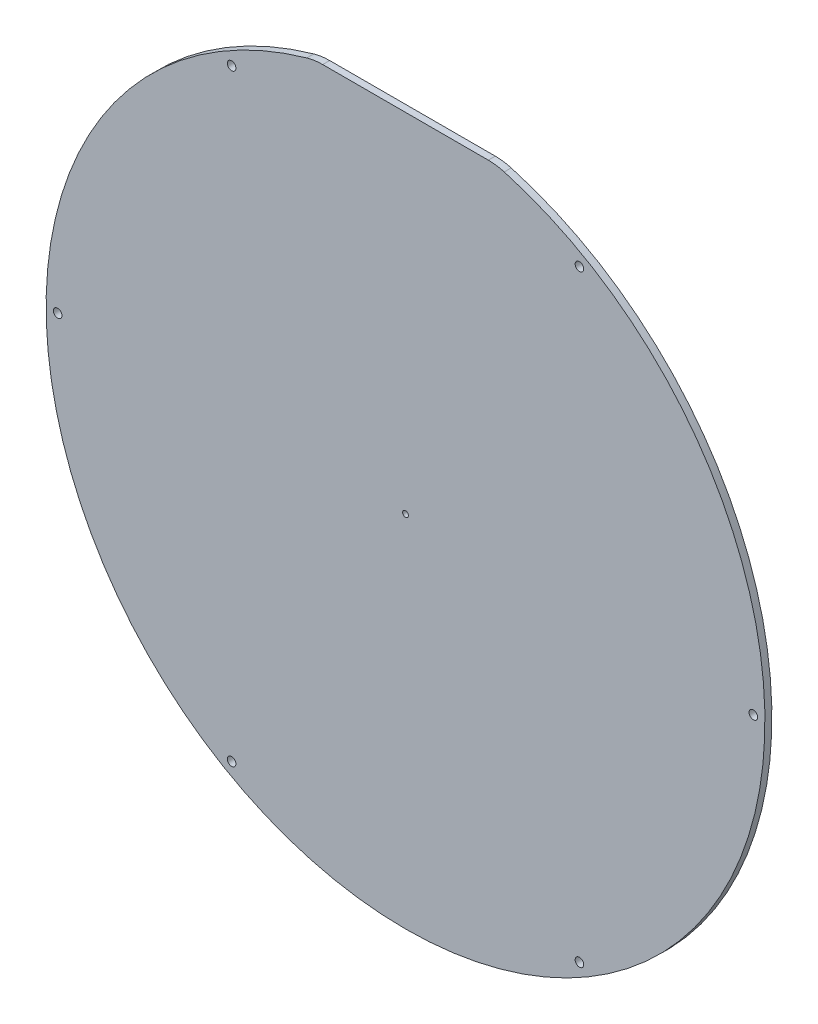
ISO-10303-21;
HEADER;
FILE_DESCRIPTION(('STEP AP214'),'2;1');
FILE_NAME('part.step','',(''),(''),'','','');
FILE_SCHEMA(('AUTOMOTIVE_DESIGN { 1 0 10303 214 1 1 1 1 }'));
ENDSEC;
DATA;
#1=APPLICATION_CONTEXT('core data for automotive mechanical design processes');
#2=APPLICATION_PROTOCOL_DEFINITION('international standard','automotive_design',2000,#1);
#3=PRODUCT_CONTEXT('',#1,'mechanical');
#4=PRODUCT('Part','Part','',(#3));
#5=PRODUCT_RELATED_PRODUCT_CATEGORY('part','',(#4));
#6=PRODUCT_DEFINITION_FORMATION('','',#4);
#7=PRODUCT_DEFINITION_CONTEXT('part definition',#1,'design');
#8=PRODUCT_DEFINITION('design','',#6,#7);
#9=PRODUCT_DEFINITION_SHAPE('','',#8);
#10=(LENGTH_UNIT() NAMED_UNIT(*) SI_UNIT(.MILLI.,.METRE.));
#11=(NAMED_UNIT(*) PLANE_ANGLE_UNIT() SI_UNIT($,.RADIAN.));
#12=(NAMED_UNIT(*) SI_UNIT($,.STERADIAN.) SOLID_ANGLE_UNIT());
#13=UNCERTAINTY_MEASURE_WITH_UNIT(LENGTH_MEASURE(1.E-05),#10,'distance_accuracy_value','');
#14=(GEOMETRIC_REPRESENTATION_CONTEXT(3) GLOBAL_UNCERTAINTY_ASSIGNED_CONTEXT((#13)) GLOBAL_UNIT_ASSIGNED_CONTEXT((#10,
#11,#12)) REPRESENTATION_CONTEXT('',''));
#15=CARTESIAN_POINT('',(0.,0.,0.));
#16=DIRECTION('',(0.,0.,1.));
#17=DIRECTION('',(1.,0.,0.));
#18=AXIS2_PLACEMENT_3D('',#15,#16,#17);
#19=CARTESIAN_POINT('',(0.,0.,3.));
#20=DIRECTION('',(0.,0.,1.));
#21=DIRECTION('',(1.,0.,0.));
#22=AXIS2_PLACEMENT_3D('',#19,#20,#21);
#23=PLANE('',#22);
#24=CARTESIAN_POINT('',(0.,0.,3.));
#25=DIRECTION('',(0.,0.,1.));
#26=DIRECTION('',(1.,0.,0.));
#27=AXIS2_PLACEMENT_3D('',#24,#25,#26);
#28=CIRCLE('',#27,1.25);
#29=CARTESIAN_POINT('',(1.25,0.,3.));
#30=VERTEX_POINT('',#29);
#31=EDGE_CURVE('E108',#30,#30,#28,.T.);
#32=ORIENTED_EDGE('',*,*,#31,.F.);
#33=EDGE_LOOP('',(#32));
#34=FACE_BOUND('',#33,.T.);
#35=CARTESIAN_POINT('',(-150.,0.,3.));
#36=DIRECTION('',(0.,0.,1.));
#37=DIRECTION('',(1.,0.,0.));
#38=AXIS2_PLACEMENT_3D('',#35,#36,#37);
#39=CIRCLE('',#38,1.85);
#40=CARTESIAN_POINT('',(-148.15,0.,3.));
#41=VERTEX_POINT('',#40);
#42=EDGE_CURVE('E147',#41,#41,#39,.T.);
#43=ORIENTED_EDGE('',*,*,#42,.F.);
#44=EDGE_LOOP('',(#43));
#45=FACE_BOUND('',#44,.T.);
#46=CARTESIAN_POINT('',(-74.9999999999997,-129.903810567666,3.));
#47=DIRECTION('',(0.,0.,1.));
#48=DIRECTION('',(0.499999999999998,0.86602540378444,0.));
#49=AXIS2_PLACEMENT_3D('',#46,#47,#48);
#50=CIRCLE('',#49,1.85);
#51=CARTESIAN_POINT('',(-74.0749999999997,-128.301663570665,3.));
#52=VERTEX_POINT('',#51);
#53=EDGE_CURVE('E154',#52,#52,#50,.T.);
#54=ORIENTED_EDGE('',*,*,#53,.F.);
#55=EDGE_LOOP('',(#54));
#56=FACE_BOUND('',#55,.T.);
#57=CARTESIAN_POINT('',(75.0000000000006,-129.903810567665,3.));
#58=DIRECTION('',(0.,0.,1.));
#59=DIRECTION('',(-0.500000000000004,0.866025403784436,0.));
#60=AXIS2_PLACEMENT_3D('',#57,#58,#59);
#61=CIRCLE('',#60,1.85);
#62=CARTESIAN_POINT('',(74.0750000000006,-128.301663570664,3.));
#63=VERTEX_POINT('',#62);
#64=EDGE_CURVE('E160',#63,#63,#61,.T.);
#65=ORIENTED_EDGE('',*,*,#64,.F.);
#66=EDGE_LOOP('',(#65));
#67=FACE_BOUND('',#66,.T.);
#68=CARTESIAN_POINT('',(150.,0.,3.));
#69=DIRECTION('',(0.,0.,1.));
#70=DIRECTION('',(-1.,0.,0.));
#71=AXIS2_PLACEMENT_3D('',#68,#69,#70);
#72=CIRCLE('',#71,1.85);
#73=CARTESIAN_POINT('',(148.15,0.,3.));
#74=VERTEX_POINT('',#73);
#75=EDGE_CURVE('E166',#74,#74,#72,.T.);
#76=ORIENTED_EDGE('',*,*,#75,.F.);
#77=EDGE_LOOP('',(#76));
#78=FACE_BOUND('',#77,.T.);
#79=CARTESIAN_POINT('',(74.9999999999988,129.903810567666,3.));
#80=DIRECTION('',(0.,0.,1.));
#81=DIRECTION('',(-0.499999999999992,-0.866025403784443,0.));
#82=AXIS2_PLACEMENT_3D('',#79,#80,#81);
#83=CIRCLE('',#82,1.85);
#84=CARTESIAN_POINT('',(74.0749999999988,128.301663570665,3.));
#85=VERTEX_POINT('',#84);
#86=EDGE_CURVE('E172',#85,#85,#83,.T.);
#87=ORIENTED_EDGE('',*,*,#86,.F.);
#88=EDGE_LOOP('',(#87));
#89=FACE_BOUND('',#88,.T.);
#90=CARTESIAN_POINT('',(-75.0000000000015,129.903810567665,3.));
#91=DIRECTION('',(0.,0.,1.));
#92=DIRECTION('',(0.50000000000001,-0.866025403784433,0.));
#93=AXIS2_PLACEMENT_3D('',#90,#91,#92);
#94=CIRCLE('',#93,1.85);
#95=CARTESIAN_POINT('',(-74.0750000000015,128.301663570664,3.));
#96=VERTEX_POINT('',#95);
#97=EDGE_CURVE('E86',#96,#96,#94,.T.);
#98=ORIENTED_EDGE('',*,*,#97,.F.);
#99=EDGE_LOOP('',(#98));
#100=FACE_BOUND('',#99,.T.);
#101=CARTESIAN_POINT('',(0.,0.,3.));
#102=DIRECTION('',(0.,0.,1.));
#103=DIRECTION('',(1.,0.,0.));
#104=AXIS2_PLACEMENT_3D('',#101,#102,#103);
#105=CIRCLE('',#104,155.);
#106=CARTESIAN_POINT('',(-42.5739002470825,149.038461538462,3.));
#107=VERTEX_POINT('',#106);
#108=CARTESIAN_POINT('',(42.5739002470825,149.038461538462,3.));
#109=VERTEX_POINT('',#108);
#110=EDGE_CURVE('E74',#107,#109,#105,.T.);
#111=ORIENTED_EDGE('',*,*,#110,.T.);
#112=CARTESIAN_POINT('',(35.7071421427144,125.,3.));
#113=DIRECTION('',(0.,0.,1.));
#114=DIRECTION('',(1.,0.,0.));
#115=AXIS2_PLACEMENT_3D('',#112,#113,#114);
#116=CIRCLE('',#115,25.);
#117=CARTESIAN_POINT('',(35.7071421427144,150.,3.));
#118=VERTEX_POINT('',#117);
#119=EDGE_CURVE('E11',#109,#118,#116,.T.);
#120=ORIENTED_EDGE('',*,*,#119,.T.);
#121=DIRECTION('',(-1.,0.,0.));
#122=VECTOR('',#121,1.);
#123=CARTESIAN_POINT('',(0.,150.,3.));
#124=LINE('',#123,#122);
#125=CARTESIAN_POINT('',(-35.7071421427144,150.,3.));
#126=VERTEX_POINT('',#125);
#127=EDGE_CURVE('E73',#118,#126,#124,.T.);
#128=ORIENTED_EDGE('',*,*,#127,.T.);
#129=CARTESIAN_POINT('',(-35.7071421427144,125.,3.));
#130=DIRECTION('',(0.,0.,1.));
#131=DIRECTION('',(1.,0.,0.));
#132=AXIS2_PLACEMENT_3D('',#129,#130,#131);
#133=CIRCLE('',#132,25.);
#134=EDGE_CURVE('E42',#126,#107,#133,.T.);
#135=ORIENTED_EDGE('',*,*,#134,.T.);
#136=EDGE_LOOP('',(#111,#120,#128,#135));
#137=FACE_BOUND('',#136,.T.);
#138=ADVANCED_FACE('F34',(#34,#45,#56,#67,#78,#89,#100,#137),#23,.T.);
#139=CARTESIAN_POINT('',(0.,0.,0.));
#140=DIRECTION('',(0.,0.,1.));
#141=DIRECTION('',(1.,0.,0.));
#142=AXIS2_PLACEMENT_3D('',#139,#140,#141);
#143=PLANE('',#142);
#144=CARTESIAN_POINT('',(0.,0.,0.));
#145=DIRECTION('',(0.,0.,1.));
#146=DIRECTION('',(1.,0.,0.));
#147=AXIS2_PLACEMENT_3D('',#144,#145,#146);
#148=CIRCLE('',#147,1.25);
#149=CARTESIAN_POINT('',(1.25,0.,0.));
#150=VERTEX_POINT('',#149);
#151=EDGE_CURVE('E142',#150,#150,#148,.T.);
#152=ORIENTED_EDGE('',*,*,#151,.T.);
#153=EDGE_LOOP('',(#152));
#154=FACE_BOUND('',#153,.T.);
#155=CARTESIAN_POINT('',(-150.,0.,0.));
#156=DIRECTION('',(0.,0.,1.));
#157=DIRECTION('',(1.,0.,0.));
#158=AXIS2_PLACEMENT_3D('',#155,#156,#157);
#159=CIRCLE('',#158,1.85);
#160=CARTESIAN_POINT('',(-148.15,0.,0.));
#161=VERTEX_POINT('',#160);
#162=EDGE_CURVE('E143',#161,#161,#159,.T.);
#163=ORIENTED_EDGE('',*,*,#162,.T.);
#164=EDGE_LOOP('',(#163));
#165=FACE_BOUND('',#164,.T.);
#166=CARTESIAN_POINT('',(-74.9999999999997,-129.903810567666,0.));
#167=DIRECTION('',(0.,0.,1.));
#168=DIRECTION('',(0.499999999999998,0.86602540378444,0.));
#169=AXIS2_PLACEMENT_3D('',#166,#167,#168);
#170=CIRCLE('',#169,1.85);
#171=CARTESIAN_POINT('',(-74.0749999999997,-128.301663570665,0.));
#172=VERTEX_POINT('',#171);
#173=EDGE_CURVE('E152',#172,#172,#170,.T.);
#174=ORIENTED_EDGE('',*,*,#173,.T.);
#175=EDGE_LOOP('',(#174));
#176=FACE_BOUND('',#175,.T.);
#177=CARTESIAN_POINT('',(75.0000000000006,-129.903810567665,0.));
#178=DIRECTION('',(0.,0.,1.));
#179=DIRECTION('',(-0.500000000000004,0.866025403784436,0.));
#180=AXIS2_PLACEMENT_3D('',#177,#178,#179);
#181=CIRCLE('',#180,1.85);
#182=CARTESIAN_POINT('',(74.0750000000006,-128.301663570664,0.));
#183=VERTEX_POINT('',#182);
#184=EDGE_CURVE('E157',#183,#183,#181,.T.);
#185=ORIENTED_EDGE('',*,*,#184,.T.);
#186=EDGE_LOOP('',(#185));
#187=FACE_BOUND('',#186,.T.);
#188=CARTESIAN_POINT('',(150.,0.,0.));
#189=DIRECTION('',(0.,0.,1.));
#190=DIRECTION('',(-1.,0.,0.));
#191=AXIS2_PLACEMENT_3D('',#188,#189,#190);
#192=CIRCLE('',#191,1.85);
#193=CARTESIAN_POINT('',(148.15,0.,0.));
#194=VERTEX_POINT('',#193);
#195=EDGE_CURVE('E163',#194,#194,#192,.T.);
#196=ORIENTED_EDGE('',*,*,#195,.T.);
#197=EDGE_LOOP('',(#196));
#198=FACE_BOUND('',#197,.T.);
#199=CARTESIAN_POINT('',(74.9999999999988,129.903810567666,0.));
#200=DIRECTION('',(0.,0.,1.));
#201=DIRECTION('',(-0.499999999999992,-0.866025403784443,0.));
#202=AXIS2_PLACEMENT_3D('',#199,#200,#201);
#203=CIRCLE('',#202,1.85);
#204=CARTESIAN_POINT('',(74.0749999999988,128.301663570665,0.));
#205=VERTEX_POINT('',#204);
#206=EDGE_CURVE('E169',#205,#205,#203,.T.);
#207=ORIENTED_EDGE('',*,*,#206,.T.);
#208=EDGE_LOOP('',(#207));
#209=FACE_BOUND('',#208,.T.);
#210=CARTESIAN_POINT('',(-75.0000000000015,129.903810567665,0.));
#211=DIRECTION('',(0.,0.,1.));
#212=DIRECTION('',(0.50000000000001,-0.866025403784433,0.));
#213=AXIS2_PLACEMENT_3D('',#210,#211,#212);
#214=CIRCLE('',#213,1.85);
#215=CARTESIAN_POINT('',(-74.0750000000015,128.301663570664,0.));
#216=VERTEX_POINT('',#215);
#217=EDGE_CURVE('E175',#216,#216,#214,.T.);
#218=ORIENTED_EDGE('',*,*,#217,.T.);
#219=EDGE_LOOP('',(#218));
#220=FACE_BOUND('',#219,.T.);
#221=DIRECTION('',(-1.,0.,0.));
#222=VECTOR('',#221,1.);
#223=CARTESIAN_POINT('',(0.,150.,0.));
#224=LINE('',#223,#222);
#225=CARTESIAN_POINT('',(35.7071421427144,150.,0.));
#226=VERTEX_POINT('',#225);
#227=CARTESIAN_POINT('',(-35.7071421427144,150.,0.));
#228=VERTEX_POINT('',#227);
#229=EDGE_CURVE('E87',#226,#228,#224,.T.);
#230=ORIENTED_EDGE('',*,*,#229,.F.);
#231=CARTESIAN_POINT('',(35.7071421427144,125.,0.));
#232=DIRECTION('',(0.,0.,1.));
#233=DIRECTION('',(1.,0.,0.));
#234=AXIS2_PLACEMENT_3D('',#231,#232,#233);
#235=CIRCLE('',#234,25.);
#236=CARTESIAN_POINT('',(42.5739002470825,149.038461538462,0.));
#237=VERTEX_POINT('',#236);
#238=EDGE_CURVE('E90',#226,#237,#235,.F.);
#239=ORIENTED_EDGE('',*,*,#238,.T.);
#240=CARTESIAN_POINT('',(0.,0.,0.));
#241=DIRECTION('',(0.,0.,1.));
#242=DIRECTION('',(1.,0.,0.));
#243=AXIS2_PLACEMENT_3D('',#240,#241,#242);
#244=CIRCLE('',#243,155.);
#245=CARTESIAN_POINT('',(-42.5739002470825,149.038461538462,0.));
#246=VERTEX_POINT('',#245);
#247=EDGE_CURVE('E103',#246,#237,#244,.T.);
#248=ORIENTED_EDGE('',*,*,#247,.F.);
#249=CARTESIAN_POINT('',(-35.7071421427144,125.,0.));
#250=DIRECTION('',(0.,0.,1.));
#251=DIRECTION('',(1.,0.,0.));
#252=AXIS2_PLACEMENT_3D('',#249,#250,#251);
#253=CIRCLE('',#252,25.);
#254=EDGE_CURVE('E91',#246,#228,#253,.F.);
#255=ORIENTED_EDGE('',*,*,#254,.T.);
#256=EDGE_LOOP('',(#230,#239,#248,#255));
#257=FACE_BOUND('',#256,.T.);
#258=ADVANCED_FACE('F107',(#154,#165,#176,#187,#198,#209,#220,#257),#143,.F.);
#259=CARTESIAN_POINT('',(0.,0.,3.));
#260=DIRECTION('',(0.,0.,-1.));
#261=DIRECTION('',(-1.,0.,0.));
#262=AXIS2_PLACEMENT_3D('',#259,#260,#261);
#263=CYLINDRICAL_SURFACE('',#262,155.);
#264=ORIENTED_EDGE('',*,*,#247,.T.);
#265=DIRECTION('',(0.,0.,-1.));
#266=VECTOR('',#265,1.);
#267=CARTESIAN_POINT('',(42.5739002470825,149.038461538462,3.));
#268=LINE('',#267,#266);
#269=EDGE_CURVE('E49',#237,#109,#268,.F.);
#270=ORIENTED_EDGE('',*,*,#269,.T.);
#271=ORIENTED_EDGE('',*,*,#110,.F.);
#272=DIRECTION('',(0.,0.,-1.));
#273=VECTOR('',#272,1.);
#274=CARTESIAN_POINT('',(-42.5739002470825,149.038461538462,3.));
#275=LINE('',#274,#273);
#276=EDGE_CURVE('E98',#107,#246,#275,.T.);
#277=ORIENTED_EDGE('',*,*,#276,.T.);
#278=EDGE_LOOP('',(#264,#270,#271,#277));
#279=FACE_BOUND('',#278,.T.);
#280=ADVANCED_FACE('F102',(#279),#263,.T.);
#281=CARTESIAN_POINT('',(0.,0.,3.));
#282=DIRECTION('',(0.,0.,-1.));
#283=DIRECTION('',(-1.,0.,0.));
#284=AXIS2_PLACEMENT_3D('',#281,#282,#283);
#285=CYLINDRICAL_SURFACE('',#284,1.25);
#286=ORIENTED_EDGE('',*,*,#31,.T.);
#287=EDGE_LOOP('',(#286));
#288=FACE_BOUND('',#287,.T.);
#289=ORIENTED_EDGE('',*,*,#151,.F.);
#290=EDGE_LOOP('',(#289));
#291=FACE_BOUND('',#290,.T.);
#292=ADVANCED_FACE('F124',(#288,#291),#285,.F.);
#293=CARTESIAN_POINT('',(-150.,0.,0.));
#294=DIRECTION('',(0.,0.,1.));
#295=DIRECTION('',(1.,0.,0.));
#296=AXIS2_PLACEMENT_3D('',#293,#294,#295);
#297=CYLINDRICAL_SURFACE('',#296,1.85);
#298=ORIENTED_EDGE('',*,*,#162,.F.);
#299=EDGE_LOOP('',(#298));
#300=FACE_BOUND('',#299,.T.);
#301=ORIENTED_EDGE('',*,*,#42,.T.);
#302=EDGE_LOOP('',(#301));
#303=FACE_BOUND('',#302,.T.);
#304=ADVANCED_FACE('F131',(#300,#303),#297,.F.);
#305=CARTESIAN_POINT('',(-74.9999999999997,-129.903810567666,0.));
#306=DIRECTION('',(0.,0.,1.));
#307=DIRECTION('',(1.,0.,0.));
#308=AXIS2_PLACEMENT_3D('',#305,#306,#307);
#309=CYLINDRICAL_SURFACE('',#308,1.85);
#310=ORIENTED_EDGE('',*,*,#173,.F.);
#311=EDGE_LOOP('',(#310));
#312=FACE_BOUND('',#311,.T.);
#313=ORIENTED_EDGE('',*,*,#53,.T.);
#314=EDGE_LOOP('',(#313));
#315=FACE_BOUND('',#314,.T.);
#316=ADVANCED_FACE('F136',(#312,#315),#309,.F.);
#317=CARTESIAN_POINT('',(75.0000000000006,-129.903810567665,0.));
#318=DIRECTION('',(0.,0.,1.));
#319=DIRECTION('',(1.,0.,0.));
#320=AXIS2_PLACEMENT_3D('',#317,#318,#319);
#321=CYLINDRICAL_SURFACE('',#320,1.85);
#322=ORIENTED_EDGE('',*,*,#184,.F.);
#323=EDGE_LOOP('',(#322));
#324=FACE_BOUND('',#323,.T.);
#325=ORIENTED_EDGE('',*,*,#64,.T.);
#326=EDGE_LOOP('',(#325));
#327=FACE_BOUND('',#326,.T.);
#328=ADVANCED_FACE('F203',(#324,#327),#321,.F.);
#329=CARTESIAN_POINT('',(150.,0.,0.));
#330=DIRECTION('',(0.,0.,1.));
#331=DIRECTION('',(1.,0.,0.));
#332=AXIS2_PLACEMENT_3D('',#329,#330,#331);
#333=CYLINDRICAL_SURFACE('',#332,1.85);
#334=ORIENTED_EDGE('',*,*,#195,.F.);
#335=EDGE_LOOP('',(#334));
#336=FACE_BOUND('',#335,.T.);
#337=ORIENTED_EDGE('',*,*,#75,.T.);
#338=EDGE_LOOP('',(#337));
#339=FACE_BOUND('',#338,.T.);
#340=ADVANCED_FACE('F197',(#336,#339),#333,.F.);
#341=CARTESIAN_POINT('',(74.9999999999988,129.903810567666,0.));
#342=DIRECTION('',(0.,0.,1.));
#343=DIRECTION('',(1.,0.,0.));
#344=AXIS2_PLACEMENT_3D('',#341,#342,#343);
#345=CYLINDRICAL_SURFACE('',#344,1.85);
#346=ORIENTED_EDGE('',*,*,#206,.F.);
#347=EDGE_LOOP('',(#346));
#348=FACE_BOUND('',#347,.T.);
#349=ORIENTED_EDGE('',*,*,#86,.T.);
#350=EDGE_LOOP('',(#349));
#351=FACE_BOUND('',#350,.T.);
#352=ADVANCED_FACE('F188',(#348,#351),#345,.F.);
#353=CARTESIAN_POINT('',(-75.0000000000015,129.903810567665,0.));
#354=DIRECTION('',(0.,0.,1.));
#355=DIRECTION('',(1.,0.,0.));
#356=AXIS2_PLACEMENT_3D('',#353,#354,#355);
#357=CYLINDRICAL_SURFACE('',#356,1.85);
#358=ORIENTED_EDGE('',*,*,#217,.F.);
#359=EDGE_LOOP('',(#358));
#360=FACE_BOUND('',#359,.T.);
#361=ORIENTED_EDGE('',*,*,#97,.T.);
#362=EDGE_LOOP('',(#361));
#363=FACE_BOUND('',#362,.T.);
#364=ADVANCED_FACE('F185',(#360,#363),#357,.F.);
#365=CARTESIAN_POINT('',(-60.219206672787,150.,551.02058583597));
#366=DIRECTION('',(0.,1.,0.));
#367=DIRECTION('',(0.,0.,1.));
#368=AXIS2_PLACEMENT_3D('',#365,#366,#367);
#369=PLANE('',#368);
#370=ORIENTED_EDGE('',*,*,#127,.F.);
#371=DIRECTION('',(0.,0.,1.));
#372=VECTOR('',#371,1.);
#373=CARTESIAN_POINT('',(35.7071421427144,150.,0.));
#374=LINE('',#373,#372);
#375=EDGE_CURVE('E82',#118,#226,#374,.F.);
#376=ORIENTED_EDGE('',*,*,#375,.T.);
#377=ORIENTED_EDGE('',*,*,#229,.T.);
#378=DIRECTION('',(0.,0.,1.));
#379=VECTOR('',#378,1.);
#380=CARTESIAN_POINT('',(-35.7071421427144,150.,3.));
#381=LINE('',#380,#379);
#382=EDGE_CURVE('E85',#228,#126,#381,.T.);
#383=ORIENTED_EDGE('',*,*,#382,.T.);
#384=EDGE_LOOP('',(#370,#376,#377,#383));
#385=FACE_BOUND('',#384,.T.);
#386=ADVANCED_FACE('F80',(#385),#369,.T.);
#387=CARTESIAN_POINT('',(35.7071421427144,125.,3.));
#388=DIRECTION('',(0.,0.,-1.));
#389=DIRECTION('',(-1.,0.,0.));
#390=AXIS2_PLACEMENT_3D('',#387,#388,#389);
#391=CYLINDRICAL_SURFACE('',#390,25.);
#392=ORIENTED_EDGE('',*,*,#119,.F.);
#393=ORIENTED_EDGE('',*,*,#269,.F.);
#394=ORIENTED_EDGE('',*,*,#238,.F.);
#395=ORIENTED_EDGE('',*,*,#375,.F.);
#396=EDGE_LOOP('',(#392,#393,#394,#395));
#397=FACE_BOUND('',#396,.T.);
#398=ADVANCED_FACE('F89',(#397),#391,.T.);
#399=CARTESIAN_POINT('',(-35.7071421427144,125.,3.));
#400=DIRECTION('',(0.,0.,-1.));
#401=DIRECTION('',(-1.,0.,0.));
#402=AXIS2_PLACEMENT_3D('',#399,#400,#401);
#403=CYLINDRICAL_SURFACE('',#402,25.);
#404=ORIENTED_EDGE('',*,*,#254,.F.);
#405=ORIENTED_EDGE('',*,*,#276,.F.);
#406=ORIENTED_EDGE('',*,*,#134,.F.);
#407=ORIENTED_EDGE('',*,*,#382,.F.);
#408=EDGE_LOOP('',(#404,#405,#406,#407));
#409=FACE_BOUND('',#408,.T.);
#410=ADVANCED_FACE('F36',(#409),#403,.T.);
#411=CLOSED_SHELL('',(#138,#258,#280,#292,#304,#316,#328,#340,#352,#364,#386,#398,#410));
#412=MANIFOLD_SOLID_BREP('B2',#411);
#413=ADVANCED_BREP_SHAPE_REPRESENTATION('',(#18,#412),#14);
#414=SHAPE_DEFINITION_REPRESENTATION(#9,#413);
ENDSEC;
END-ISO-10303-21;
